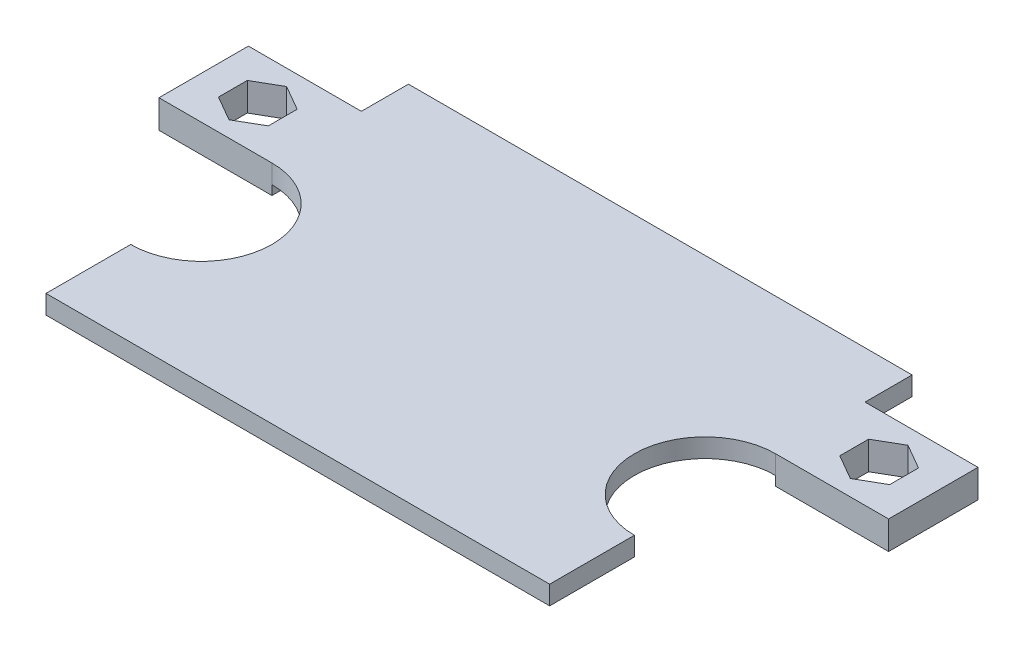
ISO-10303-21;
HEADER;
FILE_DESCRIPTION(('STEP AP214'),'2;1');
FILE_NAME('part.step','',(''),(''),'','','');
FILE_SCHEMA(('AUTOMOTIVE_DESIGN { 1 0 10303 214 1 1 1 1 }'));
ENDSEC;
DATA;
#1=APPLICATION_CONTEXT('core data for automotive mechanical design processes');
#2=APPLICATION_PROTOCOL_DEFINITION('international standard','automotive_design',2000,#1);
#3=PRODUCT_CONTEXT('',#1,'mechanical');
#4=PRODUCT('Part','Part','',(#3));
#5=PRODUCT_RELATED_PRODUCT_CATEGORY('part','',(#4));
#6=PRODUCT_DEFINITION_FORMATION('','',#4);
#7=PRODUCT_DEFINITION_CONTEXT('part definition',#1,'design');
#8=PRODUCT_DEFINITION('design','',#6,#7);
#9=PRODUCT_DEFINITION_SHAPE('','',#8);
#10=(LENGTH_UNIT() NAMED_UNIT(*) SI_UNIT(.MILLI.,.METRE.));
#11=(NAMED_UNIT(*) PLANE_ANGLE_UNIT() SI_UNIT($,.RADIAN.));
#12=(NAMED_UNIT(*) SI_UNIT($,.STERADIAN.) SOLID_ANGLE_UNIT());
#13=UNCERTAINTY_MEASURE_WITH_UNIT(LENGTH_MEASURE(1.E-05),#10,'distance_accuracy_value','');
#14=(GEOMETRIC_REPRESENTATION_CONTEXT(3) GLOBAL_UNCERTAINTY_ASSIGNED_CONTEXT((#13)) GLOBAL_UNIT_ASSIGNED_CONTEXT((#10,
#11,#12)) REPRESENTATION_CONTEXT('',''));
#15=CARTESIAN_POINT('',(0.,0.,0.));
#16=DIRECTION('',(0.,0.,1.));
#17=DIRECTION('',(1.,0.,0.));
#18=AXIS2_PLACEMENT_3D('',#15,#16,#17);
#19=CARTESIAN_POINT('',(26.75,-2.,-19.25));
#20=DIRECTION('',(-1.,0.,0.));
#21=DIRECTION('',(0.,0.,1.));
#22=AXIS2_PLACEMENT_3D('',#19,#20,#21);
#23=PLANE('',#22);
#24=DIRECTION('',(0.,1.,0.));
#25=VECTOR('',#24,1.);
#26=CARTESIAN_POINT('',(26.75,-3.,-14.25));
#27=LINE('',#26,#25);
#28=CARTESIAN_POINT('',(26.75,-2.,-14.25));
#29=VERTEX_POINT('',#28);
#30=CARTESIAN_POINT('',(26.75,0.,-14.25));
#31=VERTEX_POINT('',#30);
#32=EDGE_CURVE('E11',#29,#31,#27,.T.);
#33=ORIENTED_EDGE('',*,*,#32,.F.);
#34=DIRECTION('',(0.,0.,1.));
#35=VECTOR('',#34,1.);
#36=CARTESIAN_POINT('',(26.75,-2.,-19.25));
#37=LINE('',#36,#35);
#38=CARTESIAN_POINT('',(26.75,-2.,-19.25));
#39=VERTEX_POINT('',#38);
#40=EDGE_CURVE('E295',#39,#29,#37,.T.);
#41=ORIENTED_EDGE('',*,*,#40,.F.);
#42=DIRECTION('',(0.,1.,0.));
#43=VECTOR('',#42,1.);
#44=CARTESIAN_POINT('',(26.75,-2.,-19.25));
#45=LINE('',#44,#43);
#46=CARTESIAN_POINT('',(26.75,0.,-19.25));
#47=VERTEX_POINT('',#46);
#48=EDGE_CURVE('E70',#39,#47,#45,.T.);
#49=ORIENTED_EDGE('',*,*,#48,.T.);
#50=DIRECTION('',(0.,0.,1.));
#51=VECTOR('',#50,1.);
#52=CARTESIAN_POINT('',(26.75,0.,-19.25));
#53=LINE('',#52,#51);
#54=EDGE_CURVE('E288',#47,#31,#53,.T.);
#55=ORIENTED_EDGE('',*,*,#54,.T.);
#56=EDGE_LOOP('',(#33,#41,#49,#55));
#57=FACE_BOUND('',#56,.T.);
#58=ADVANCED_FACE('F42',(#57),#23,.F.);
#59=CARTESIAN_POINT('',(-26.75,-2.,-19.25));
#60=DIRECTION('',(-1.,0.,0.));
#61=DIRECTION('',(0.,0.,1.));
#62=AXIS2_PLACEMENT_3D('',#59,#60,#61);
#63=PLANE('',#62);
#64=DIRECTION('',(0.,0.,1.));
#65=VECTOR('',#64,1.);
#66=CARTESIAN_POINT('',(-26.75,-2.,-19.25));
#67=LINE('',#66,#65);
#68=CARTESIAN_POINT('',(-26.75,-2.,-19.25));
#69=VERTEX_POINT('',#68);
#70=CARTESIAN_POINT('',(-26.75,-2.,-14.25));
#71=VERTEX_POINT('',#70);
#72=EDGE_CURVE('E270',#69,#71,#67,.T.);
#73=ORIENTED_EDGE('',*,*,#72,.T.);
#74=DIRECTION('',(0.,1.,0.));
#75=VECTOR('',#74,1.);
#76=CARTESIAN_POINT('',(-26.75,-3.,-14.25));
#77=LINE('',#76,#75);
#78=CARTESIAN_POINT('',(-26.75,0.,-14.25));
#79=VERTEX_POINT('',#78);
#80=EDGE_CURVE('E249',#71,#79,#77,.T.);
#81=ORIENTED_EDGE('',*,*,#80,.T.);
#82=DIRECTION('',(0.,0.,1.));
#83=VECTOR('',#82,1.);
#84=CARTESIAN_POINT('',(-26.75,0.,-19.25));
#85=LINE('',#84,#83);
#86=CARTESIAN_POINT('',(-26.75,0.,-19.25));
#87=VERTEX_POINT('',#86);
#88=EDGE_CURVE('E305',#87,#79,#85,.T.);
#89=ORIENTED_EDGE('',*,*,#88,.F.);
#90=DIRECTION('',(0.,1.,0.));
#91=VECTOR('',#90,1.);
#92=CARTESIAN_POINT('',(-26.75,-2.,-19.25));
#93=LINE('',#92,#91);
#94=EDGE_CURVE('E46',#69,#87,#93,.T.);
#95=ORIENTED_EDGE('',*,*,#94,.F.);
#96=EDGE_LOOP('',(#73,#81,#89,#95));
#97=FACE_BOUND('',#96,.T.);
#98=ADVANCED_FACE('F329',(#97),#63,.T.);
#99=CARTESIAN_POINT('',(26.75,-2.,-19.25));
#100=DIRECTION('',(0.,0.,-1.));
#101=DIRECTION('',(-1.,0.,0.));
#102=AXIS2_PLACEMENT_3D('',#99,#100,#101);
#103=PLANE('',#102);
#104=DIRECTION('',(-1.,0.,0.));
#105=VECTOR('',#104,1.);
#106=CARTESIAN_POINT('',(26.75,0.,-19.25));
#107=LINE('',#106,#105);
#108=EDGE_CURVE('E300',#47,#87,#107,.T.);
#109=ORIENTED_EDGE('',*,*,#108,.F.);
#110=ORIENTED_EDGE('',*,*,#48,.F.);
#111=DIRECTION('',(-1.,0.,0.));
#112=VECTOR('',#111,1.);
#113=CARTESIAN_POINT('',(26.75,-2.,-19.25));
#114=LINE('',#113,#112);
#115=EDGE_CURVE('E286',#39,#69,#114,.T.);
#116=ORIENTED_EDGE('',*,*,#115,.T.);
#117=ORIENTED_EDGE('',*,*,#94,.T.);
#118=EDGE_LOOP('',(#109,#110,#116,#117));
#119=FACE_BOUND('',#118,.T.);
#120=ADVANCED_FACE('F44',(#119),#103,.T.);
#121=CARTESIAN_POINT('',(26.75,-2.,10.25));
#122=VERTEX_POINT('',#121);
#123=CARTESIAN_POINT('',(26.75,-2.,19.25));
#124=VERTEX_POINT('',#123);
#125=EDGE_CURVE('E294',#122,#124,#37,.T.);
#126=ORIENTED_EDGE('',*,*,#125,.F.);
#127=DIRECTION('',(0.,1.,0.));
#128=VECTOR('',#127,1.);
#129=CARTESIAN_POINT('',(26.75,-2.,10.25));
#130=LINE('',#129,#128);
#131=CARTESIAN_POINT('',(26.75,0.,10.25));
#132=VERTEX_POINT('',#131);
#133=EDGE_CURVE('E553',#122,#132,#130,.T.);
#134=ORIENTED_EDGE('',*,*,#133,.T.);
#135=CARTESIAN_POINT('',(26.75,0.,19.25));
#136=VERTEX_POINT('',#135);
#137=EDGE_CURVE('E313',#132,#136,#53,.T.);
#138=ORIENTED_EDGE('',*,*,#137,.T.);
#139=DIRECTION('',(0.,1.,0.));
#140=VECTOR('',#139,1.);
#141=CARTESIAN_POINT('',(26.75,-2.,19.25));
#142=LINE('',#141,#140);
#143=EDGE_CURVE('E318',#124,#136,#142,.T.);
#144=ORIENTED_EDGE('',*,*,#143,.F.);
#145=EDGE_LOOP('',(#126,#134,#138,#144));
#146=FACE_BOUND('',#145,.T.);
#147=ADVANCED_FACE('F352',(#146),#23,.F.);
#148=CARTESIAN_POINT('',(26.75,-2.,19.25));
#149=DIRECTION('',(0.,0.,-1.));
#150=DIRECTION('',(-1.,0.,0.));
#151=AXIS2_PLACEMENT_3D('',#148,#149,#150);
#152=PLANE('',#151);
#153=DIRECTION('',(-1.,0.,0.));
#154=VECTOR('',#153,1.);
#155=CARTESIAN_POINT('',(26.75,0.,19.25));
#156=LINE('',#155,#154);
#157=CARTESIAN_POINT('',(-26.75,0.,19.25));
#158=VERTEX_POINT('',#157);
#159=EDGE_CURVE('E309',#136,#158,#156,.T.);
#160=ORIENTED_EDGE('',*,*,#159,.T.);
#161=DIRECTION('',(0.,1.,0.));
#162=VECTOR('',#161,1.);
#163=CARTESIAN_POINT('',(-26.75,-2.,19.25));
#164=LINE('',#163,#162);
#165=CARTESIAN_POINT('',(-26.75,-2.,19.25));
#166=VERTEX_POINT('',#165);
#167=EDGE_CURVE('E321',#166,#158,#164,.T.);
#168=ORIENTED_EDGE('',*,*,#167,.F.);
#169=DIRECTION('',(-1.,0.,0.));
#170=VECTOR('',#169,1.);
#171=CARTESIAN_POINT('',(26.75,-2.,19.25));
#172=LINE('',#171,#170);
#173=EDGE_CURVE('E291',#124,#166,#172,.T.);
#174=ORIENTED_EDGE('',*,*,#173,.F.);
#175=ORIENTED_EDGE('',*,*,#143,.T.);
#176=EDGE_LOOP('',(#160,#168,#174,#175));
#177=FACE_BOUND('',#176,.T.);
#178=ADVANCED_FACE('F356',(#177),#152,.F.);
#179=DIRECTION('',(0.,1.,0.));
#180=VECTOR('',#179,1.);
#181=CARTESIAN_POINT('',(-26.75,-2.,10.25));
#182=LINE('',#181,#180);
#183=CARTESIAN_POINT('',(-26.75,-2.,10.25));
#184=VERTEX_POINT('',#183);
#185=CARTESIAN_POINT('',(-26.75,0.,10.25));
#186=VERTEX_POINT('',#185);
#187=EDGE_CURVE('E261',#184,#186,#182,.T.);
#188=ORIENTED_EDGE('',*,*,#187,.F.);
#189=EDGE_CURVE('E259',#184,#166,#67,.T.);
#190=ORIENTED_EDGE('',*,*,#189,.T.);
#191=ORIENTED_EDGE('',*,*,#167,.T.);
#192=EDGE_CURVE('E304',#186,#158,#85,.T.);
#193=ORIENTED_EDGE('',*,*,#192,.F.);
#194=EDGE_LOOP('',(#188,#190,#191,#193));
#195=FACE_BOUND('',#194,.T.);
#196=ADVANCED_FACE('F561',(#195),#63,.T.);
#197=CARTESIAN_POINT('',(0.,-2.,0.));
#198=DIRECTION('',(0.,1.,0.));
#199=DIRECTION('',(0.,0.,1.));
#200=AXIS2_PLACEMENT_3D('',#197,#198,#199);
#201=PLANE('',#200);
#202=ORIENTED_EDGE('',*,*,#189,.F.);
#203=CARTESIAN_POINT('',(-26.75,-2.,2.75000000000001));
#204=DIRECTION('',(0.,1.,0.));
#205=DIRECTION('',(0.,0.,-1.));
#206=AXIS2_PLACEMENT_3D('',#203,#204,#205);
#207=CIRCLE('',#206,7.5);
#208=CARTESIAN_POINT('',(-26.75,-2.,-4.74999999999999));
#209=VERTEX_POINT('',#208);
#210=EDGE_CURVE('E240',#184,#209,#207,.T.);
#211=ORIENTED_EDGE('',*,*,#210,.T.);
#212=EDGE_CURVE('E257',#71,#209,#67,.T.);
#213=ORIENTED_EDGE('',*,*,#212,.F.);
#214=ORIENTED_EDGE('',*,*,#72,.F.);
#215=ORIENTED_EDGE('',*,*,#115,.F.);
#216=ORIENTED_EDGE('',*,*,#40,.T.);
#217=CARTESIAN_POINT('',(26.75,-2.,-4.75));
#218=VERTEX_POINT('',#217);
#219=EDGE_CURVE('E299',#29,#218,#37,.T.);
#220=ORIENTED_EDGE('',*,*,#219,.T.);
#221=CARTESIAN_POINT('',(26.75,-2.,2.75));
#222=DIRECTION('',(0.,1.,0.));
#223=DIRECTION('',(0.,0.,1.));
#224=AXIS2_PLACEMENT_3D('',#221,#222,#223);
#225=CIRCLE('',#224,7.5);
#226=EDGE_CURVE('E342',#218,#122,#225,.T.);
#227=ORIENTED_EDGE('',*,*,#226,.T.);
#228=ORIENTED_EDGE('',*,*,#125,.T.);
#229=ORIENTED_EDGE('',*,*,#173,.T.);
#230=EDGE_LOOP('',(#202,#211,#213,#214,#215,#216,#220,#227,#228,#229));
#231=FACE_BOUND('',#230,.T.);
#232=ADVANCED_FACE('F256',(#231),#201,.F.);
#233=CARTESIAN_POINT('',(0.,0.,0.));
#234=DIRECTION('',(0.,1.,0.));
#235=DIRECTION('',(0.,0.,1.));
#236=AXIS2_PLACEMENT_3D('',#233,#234,#235);
#237=PLANE('',#236);
#238=CARTESIAN_POINT('',(-26.75,0.,2.75000000000001));
#239=DIRECTION('',(0.,1.,0.));
#240=DIRECTION('',(0.,0.,-1.));
#241=AXIS2_PLACEMENT_3D('',#238,#239,#240);
#242=CIRCLE('',#241,7.5);
#243=CARTESIAN_POINT('',(-26.75,0.,-4.74999999999999));
#244=VERTEX_POINT('',#243);
#245=EDGE_CURVE('E243',#186,#244,#242,.T.);
#246=ORIENTED_EDGE('',*,*,#245,.F.);
#247=ORIENTED_EDGE('',*,*,#192,.T.);
#248=ORIENTED_EDGE('',*,*,#159,.F.);
#249=ORIENTED_EDGE('',*,*,#137,.F.);
#250=CARTESIAN_POINT('',(26.75,0.,2.75));
#251=DIRECTION('',(0.,1.,0.));
#252=DIRECTION('',(0.,0.,1.));
#253=AXIS2_PLACEMENT_3D('',#250,#251,#252);
#254=CIRCLE('',#253,7.5);
#255=CARTESIAN_POINT('',(26.75,0.,-4.75));
#256=VERTEX_POINT('',#255);
#257=EDGE_CURVE('E552',#256,#132,#254,.T.);
#258=ORIENTED_EDGE('',*,*,#257,.F.);
#259=DIRECTION('',(1.,0.,0.));
#260=VECTOR('',#259,1.);
#261=CARTESIAN_POINT('',(38.75,0.,-4.75));
#262=LINE('',#261,#260);
#263=CARTESIAN_POINT('',(38.75,0.,-4.75));
#264=VERTEX_POINT('',#263);
#265=EDGE_CURVE('E501',#256,#264,#262,.T.);
#266=ORIENTED_EDGE('',*,*,#265,.T.);
#267=DIRECTION('',(0.,0.,-1.));
#268=VECTOR('',#267,1.);
#269=CARTESIAN_POINT('',(38.75,0.,-4.75));
#270=LINE('',#269,#268);
#271=CARTESIAN_POINT('',(38.75,0.,-14.25));
#272=VERTEX_POINT('',#271);
#273=EDGE_CURVE('E536',#264,#272,#270,.T.);
#274=ORIENTED_EDGE('',*,*,#273,.T.);
#275=DIRECTION('',(-1.,0.,0.));
#276=VECTOR('',#275,1.);
#277=CARTESIAN_POINT('',(38.75,0.,-14.25));
#278=LINE('',#277,#276);
#279=EDGE_CURVE('E336',#272,#31,#278,.T.);
#280=ORIENTED_EDGE('',*,*,#279,.T.);
#281=ORIENTED_EDGE('',*,*,#54,.F.);
#282=ORIENTED_EDGE('',*,*,#108,.T.);
#283=ORIENTED_EDGE('',*,*,#88,.T.);
#284=DIRECTION('',(-1.,0.,0.));
#285=VECTOR('',#284,1.);
#286=CARTESIAN_POINT('',(-38.75,0.,-14.25));
#287=LINE('',#286,#285);
#288=CARTESIAN_POINT('',(-38.75,0.,-14.25));
#289=VERTEX_POINT('',#288);
#290=EDGE_CURVE('E61',#79,#289,#287,.T.);
#291=ORIENTED_EDGE('',*,*,#290,.T.);
#292=DIRECTION('',(0.,0.,1.));
#293=VECTOR('',#292,1.);
#294=CARTESIAN_POINT('',(-38.75,0.,-4.74999999999999));
#295=LINE('',#294,#293);
#296=CARTESIAN_POINT('',(-38.75,0.,-4.74999999999999));
#297=VERTEX_POINT('',#296);
#298=EDGE_CURVE('E369',#289,#297,#295,.T.);
#299=ORIENTED_EDGE('',*,*,#298,.T.);
#300=DIRECTION('',(1.,0.,0.));
#301=VECTOR('',#300,1.);
#302=CARTESIAN_POINT('',(-38.75,0.,-4.74999999999999));
#303=LINE('',#302,#301);
#304=EDGE_CURVE('E366',#297,#244,#303,.T.);
#305=ORIENTED_EDGE('',*,*,#304,.T.);
#306=EDGE_LOOP('',(#246,#247,#248,#249,#258,#266,#274,#280,#281,#282,#283,#291,#299,#305));
#307=FACE_BOUND('',#306,.T.);
#308=DIRECTION('',(0.866025403784439,0.,-0.5));
#309=VECTOR('',#308,1.);
#310=CARTESIAN_POINT('',(-33.,0.,-6.44004357329498));
#311=LINE('',#310,#309);
#312=CARTESIAN_POINT('',(-33.,0.,-6.44004357329498));
#313=VERTEX_POINT('',#312);
#314=CARTESIAN_POINT('',(-30.35,0.,-7.97002178664749));
#315=VERTEX_POINT('',#314);
#316=EDGE_CURVE('E420',#313,#315,#311,.T.);
#317=ORIENTED_EDGE('',*,*,#316,.F.);
#318=DIRECTION('',(0.866025403784439,0.,0.5));
#319=VECTOR('',#318,1.);
#320=CARTESIAN_POINT('',(-35.65,0.,-7.97002178664748));
#321=LINE('',#320,#319);
#322=CARTESIAN_POINT('',(-35.65,0.,-7.97002178664748));
#323=VERTEX_POINT('',#322);
#324=EDGE_CURVE('E424',#323,#313,#321,.T.);
#325=ORIENTED_EDGE('',*,*,#324,.F.);
#326=DIRECTION('',(0.,0.,1.));
#327=VECTOR('',#326,1.);
#328=CARTESIAN_POINT('',(-35.65,0.,-11.0299782133525));
#329=LINE('',#328,#327);
#330=CARTESIAN_POINT('',(-35.65,0.,-11.0299782133525));
#331=VERTEX_POINT('',#330);
#332=EDGE_CURVE('E403',#331,#323,#329,.T.);
#333=ORIENTED_EDGE('',*,*,#332,.F.);
#334=DIRECTION('',(-0.866025403784439,0.,0.5));
#335=VECTOR('',#334,1.);
#336=CARTESIAN_POINT('',(-33.,0.,-12.559956426705));
#337=LINE('',#336,#335);
#338=CARTESIAN_POINT('',(-33.,0.,-12.559956426705));
#339=VERTEX_POINT('',#338);
#340=EDGE_CURVE('E408',#339,#331,#337,.T.);
#341=ORIENTED_EDGE('',*,*,#340,.F.);
#342=DIRECTION('',(-0.866025403784439,0.,-0.5));
#343=VECTOR('',#342,1.);
#344=CARTESIAN_POINT('',(-30.35,0.,-11.0299782133525));
#345=LINE('',#344,#343);
#346=CARTESIAN_POINT('',(-30.35,0.,-11.0299782133525));
#347=VERTEX_POINT('',#346);
#348=EDGE_CURVE('E412',#347,#339,#345,.T.);
#349=ORIENTED_EDGE('',*,*,#348,.F.);
#350=DIRECTION('',(0.,0.,-1.));
#351=VECTOR('',#350,1.);
#352=CARTESIAN_POINT('',(-30.35,0.,-7.97002178664749));
#353=LINE('',#352,#351);
#354=EDGE_CURVE('E416',#315,#347,#353,.T.);
#355=ORIENTED_EDGE('',*,*,#354,.F.);
#356=EDGE_LOOP('',(#317,#325,#333,#341,#349,#355));
#357=FACE_BOUND('',#356,.T.);
#358=DIRECTION('',(0.,0.,-1.));
#359=VECTOR('',#358,1.);
#360=CARTESIAN_POINT('',(35.65,0.,-11.0299782133525));
#361=LINE('',#360,#359);
#362=CARTESIAN_POINT('',(35.65,0.,-7.9700217866475));
#363=VERTEX_POINT('',#362);
#364=CARTESIAN_POINT('',(35.65,0.,-11.0299782133525));
#365=VERTEX_POINT('',#364);
#366=EDGE_CURVE('E427',#363,#365,#361,.T.);
#367=ORIENTED_EDGE('',*,*,#366,.F.);
#368=DIRECTION('',(0.866025403784437,0.,-0.500000000000003));
#369=VECTOR('',#368,1.);
#370=CARTESIAN_POINT('',(35.65,0.,-7.9700217866475));
#371=LINE('',#370,#369);
#372=CARTESIAN_POINT('',(33.,0.,-6.44004357329499));
#373=VERTEX_POINT('',#372);
#374=EDGE_CURVE('E454',#373,#363,#371,.T.);
#375=ORIENTED_EDGE('',*,*,#374,.F.);
#376=DIRECTION('',(0.866025403784439,0.,0.5));
#377=VECTOR('',#376,1.);
#378=CARTESIAN_POINT('',(33.,0.,-6.44004357329499));
#379=LINE('',#378,#377);
#380=CARTESIAN_POINT('',(30.35,0.,-7.9700217866475));
#381=VERTEX_POINT('',#380);
#382=EDGE_CURVE('E490',#381,#373,#379,.T.);
#383=ORIENTED_EDGE('',*,*,#382,.F.);
#384=DIRECTION('',(0.,0.,1.));
#385=VECTOR('',#384,1.);
#386=CARTESIAN_POINT('',(30.35,0.,-7.9700217866475));
#387=LINE('',#386,#385);
#388=CARTESIAN_POINT('',(30.35,0.,-11.0299782133525));
#389=VERTEX_POINT('',#388);
#390=EDGE_CURVE('E486',#389,#381,#387,.T.);
#391=ORIENTED_EDGE('',*,*,#390,.F.);
#392=DIRECTION('',(-0.866025403784439,0.,0.5));
#393=VECTOR('',#392,1.);
#394=CARTESIAN_POINT('',(30.35,0.,-11.0299782133525));
#395=LINE('',#394,#393);
#396=CARTESIAN_POINT('',(33.,0.,-12.559956426705));
#397=VERTEX_POINT('',#396);
#398=EDGE_CURVE('E482',#397,#389,#395,.T.);
#399=ORIENTED_EDGE('',*,*,#398,.F.);
#400=DIRECTION('',(-0.866025403784438,0.,-0.500000000000002));
#401=VECTOR('',#400,1.);
#402=CARTESIAN_POINT('',(33.,0.,-12.559956426705));
#403=LINE('',#402,#401);
#404=EDGE_CURVE('E478',#365,#397,#403,.T.);
#405=ORIENTED_EDGE('',*,*,#404,.F.);
#406=EDGE_LOOP('',(#367,#375,#383,#391,#399,#405));
#407=FACE_BOUND('',#406,.T.);
#408=ADVANCED_FACE('F331',(#307,#357,#407),#237,.T.);
#409=CARTESIAN_POINT('',(-38.75,-3.,-4.74999999999999));
#410=DIRECTION('',(-1.,0.,0.));
#411=DIRECTION('',(0.,0.,1.));
#412=AXIS2_PLACEMENT_3D('',#409,#410,#411);
#413=PLANE('',#412);
#414=ORIENTED_EDGE('',*,*,#298,.F.);
#415=DIRECTION('',(0.,1.,0.));
#416=VECTOR('',#415,1.);
#417=CARTESIAN_POINT('',(-38.75,-3.,-14.25));
#418=LINE('',#417,#416);
#419=CARTESIAN_POINT('',(-38.75,-3.,-14.25));
#420=VERTEX_POINT('',#419);
#421=EDGE_CURVE('E280',#420,#289,#418,.T.);
#422=ORIENTED_EDGE('',*,*,#421,.F.);
#423=DIRECTION('',(0.,0.,1.));
#424=VECTOR('',#423,1.);
#425=CARTESIAN_POINT('',(-38.75,-3.,-4.74999999999999));
#426=LINE('',#425,#424);
#427=CARTESIAN_POINT('',(-38.75,-3.,-4.74999999999999));
#428=VERTEX_POINT('',#427);
#429=EDGE_CURVE('E365',#420,#428,#426,.T.);
#430=ORIENTED_EDGE('',*,*,#429,.T.);
#431=DIRECTION('',(0.,1.,0.));
#432=VECTOR('',#431,1.);
#433=CARTESIAN_POINT('',(-38.75,-3.,-4.74999999999999));
#434=LINE('',#433,#432);
#435=EDGE_CURVE('E277',#428,#297,#434,.T.);
#436=ORIENTED_EDGE('',*,*,#435,.T.);
#437=EDGE_LOOP('',(#414,#422,#430,#436));
#438=FACE_BOUND('',#437,.T.);
#439=ADVANCED_FACE('F597',(#438),#413,.T.);
#440=CARTESIAN_POINT('',(-38.75,-3.,-14.25));
#441=DIRECTION('',(0.,0.,-1.));
#442=DIRECTION('',(-1.,0.,0.));
#443=AXIS2_PLACEMENT_3D('',#440,#441,#442);
#444=PLANE('',#443);
#445=ORIENTED_EDGE('',*,*,#290,.F.);
#446=ORIENTED_EDGE('',*,*,#80,.F.);
#447=CARTESIAN_POINT('',(-26.75,-3.,-14.25));
#448=VERTEX_POINT('',#447);
#449=EDGE_CURVE('E268',#448,#71,#77,.T.);
#450=ORIENTED_EDGE('',*,*,#449,.F.);
#451=DIRECTION('',(-1.,0.,0.));
#452=VECTOR('',#451,1.);
#453=CARTESIAN_POINT('',(-38.75,-3.,-14.25));
#454=LINE('',#453,#452);
#455=EDGE_CURVE('E282',#448,#420,#454,.T.);
#456=ORIENTED_EDGE('',*,*,#455,.T.);
#457=ORIENTED_EDGE('',*,*,#421,.T.);
#458=EDGE_LOOP('',(#445,#446,#450,#456,#457));
#459=FACE_BOUND('',#458,.T.);
#460=ADVANCED_FACE('F602',(#459),#444,.T.);
#461=CARTESIAN_POINT('',(-26.75,-3.,-14.25));
#462=DIRECTION('',(1.,0.,0.));
#463=DIRECTION('',(0.,0.,-1.));
#464=AXIS2_PLACEMENT_3D('',#461,#462,#463);
#465=PLANE('',#464);
#466=ORIENTED_EDGE('',*,*,#449,.T.);
#467=ORIENTED_EDGE('',*,*,#212,.T.);
#468=DIRECTION('',(0.,1.,0.));
#469=VECTOR('',#468,1.);
#470=CARTESIAN_POINT('',(-26.75,-3.,-4.74999999999999));
#471=LINE('',#470,#469);
#472=CARTESIAN_POINT('',(-26.75,-3.,-4.74999999999999));
#473=VERTEX_POINT('',#472);
#474=EDGE_CURVE('E251',#473,#209,#471,.T.);
#475=ORIENTED_EDGE('',*,*,#474,.F.);
#476=DIRECTION('',(0.,0.,-1.));
#477=VECTOR('',#476,1.);
#478=CARTESIAN_POINT('',(-26.75,-3.,-14.25));
#479=LINE('',#478,#477);
#480=EDGE_CURVE('E376',#473,#448,#479,.T.);
#481=ORIENTED_EDGE('',*,*,#480,.T.);
#482=EDGE_LOOP('',(#466,#467,#475,#481));
#483=FACE_BOUND('',#482,.T.);
#484=ADVANCED_FACE('F265',(#483),#465,.T.);
#485=CARTESIAN_POINT('',(-38.75,-3.,-4.74999999999999));
#486=DIRECTION('',(0.,0.,1.));
#487=DIRECTION('',(1.,0.,0.));
#488=AXIS2_PLACEMENT_3D('',#485,#486,#487);
#489=PLANE('',#488);
#490=ORIENTED_EDGE('',*,*,#304,.F.);
#491=ORIENTED_EDGE('',*,*,#435,.F.);
#492=DIRECTION('',(1.,0.,0.));
#493=VECTOR('',#492,1.);
#494=CARTESIAN_POINT('',(-38.75,-3.,-4.74999999999999));
#495=LINE('',#494,#493);
#496=EDGE_CURVE('E275',#428,#473,#495,.T.);
#497=ORIENTED_EDGE('',*,*,#496,.T.);
#498=ORIENTED_EDGE('',*,*,#474,.T.);
#499=EDGE_CURVE('E237',#209,#244,#471,.T.);
#500=ORIENTED_EDGE('',*,*,#499,.T.);
#501=EDGE_LOOP('',(#490,#491,#497,#498,#500));
#502=FACE_BOUND('',#501,.T.);
#503=ADVANCED_FACE('F273',(#502),#489,.T.);
#504=CARTESIAN_POINT('',(0.,-3.,0.));
#505=DIRECTION('',(0.,-1.,0.));
#506=DIRECTION('',(0.,0.,-1.));
#507=AXIS2_PLACEMENT_3D('',#504,#505,#506);
#508=PLANE('',#507);
#509=DIRECTION('',(0.866025403784439,0.,0.5));
#510=VECTOR('',#509,1.);
#511=CARTESIAN_POINT('',(-35.65,-3.,-7.97002178664748));
#512=LINE('',#511,#510);
#513=CARTESIAN_POINT('',(-35.65,-3.,-7.97002178664748));
#514=VERTEX_POINT('',#513);
#515=CARTESIAN_POINT('',(-33.,-3.,-6.44004357329498));
#516=VERTEX_POINT('',#515);
#517=EDGE_CURVE('E407',#514,#516,#512,.T.);
#518=ORIENTED_EDGE('',*,*,#517,.T.);
#519=DIRECTION('',(0.866025403784439,0.,-0.5));
#520=VECTOR('',#519,1.);
#521=CARTESIAN_POINT('',(-33.,-3.,-6.44004357329498));
#522=LINE('',#521,#520);
#523=CARTESIAN_POINT('',(-30.35,-3.,-7.97002178664749));
#524=VERTEX_POINT('',#523);
#525=EDGE_CURVE('E443',#516,#524,#522,.T.);
#526=ORIENTED_EDGE('',*,*,#525,.T.);
#527=DIRECTION('',(0.,0.,-1.));
#528=VECTOR('',#527,1.);
#529=CARTESIAN_POINT('',(-30.35,-3.,-7.97002178664749));
#530=LINE('',#529,#528);
#531=CARTESIAN_POINT('',(-30.35,-3.,-11.0299782133525));
#532=VERTEX_POINT('',#531);
#533=EDGE_CURVE('E439',#524,#532,#530,.T.);
#534=ORIENTED_EDGE('',*,*,#533,.T.);
#535=DIRECTION('',(-0.866025403784439,0.,-0.5));
#536=VECTOR('',#535,1.);
#537=CARTESIAN_POINT('',(-30.35,-3.,-11.0299782133525));
#538=LINE('',#537,#536);
#539=CARTESIAN_POINT('',(-33.,-3.,-12.559956426705));
#540=VERTEX_POINT('',#539);
#541=EDGE_CURVE('E435',#532,#540,#538,.T.);
#542=ORIENTED_EDGE('',*,*,#541,.T.);
#543=DIRECTION('',(-0.866025403784439,0.,0.5));
#544=VECTOR('',#543,1.);
#545=CARTESIAN_POINT('',(-33.,-3.,-12.559956426705));
#546=LINE('',#545,#544);
#547=CARTESIAN_POINT('',(-35.65,-3.,-11.0299782133525));
#548=VERTEX_POINT('',#547);
#549=EDGE_CURVE('E431',#540,#548,#546,.T.);
#550=ORIENTED_EDGE('',*,*,#549,.T.);
#551=DIRECTION('',(0.,0.,1.));
#552=VECTOR('',#551,1.);
#553=CARTESIAN_POINT('',(-35.65,-3.,-11.0299782133525));
#554=LINE('',#553,#552);
#555=EDGE_CURVE('E389',#548,#514,#554,.T.);
#556=ORIENTED_EDGE('',*,*,#555,.T.);
#557=EDGE_LOOP('',(#518,#526,#534,#542,#550,#556));
#558=FACE_BOUND('',#557,.T.);
#559=ORIENTED_EDGE('',*,*,#429,.F.);
#560=ORIENTED_EDGE('',*,*,#455,.F.);
#561=ORIENTED_EDGE('',*,*,#480,.F.);
#562=ORIENTED_EDGE('',*,*,#496,.F.);
#563=EDGE_LOOP('',(#559,#560,#561,#562));
#564=FACE_BOUND('',#563,.T.);
#565=ADVANCED_FACE('F622',(#558,#564),#508,.T.);
#566=CARTESIAN_POINT('',(-35.65,-3.,-7.97002178664748));
#567=DIRECTION('',(-0.5,0.,0.866025403784438));
#568=DIRECTION('',(0.866025403784439,0.,0.5));
#569=AXIS2_PLACEMENT_3D('',#566,#567,#568);
#570=PLANE('',#569);
#571=ORIENTED_EDGE('',*,*,#324,.T.);
#572=DIRECTION('',(0.,1.,0.));
#573=VECTOR('',#572,1.);
#574=CARTESIAN_POINT('',(-33.,-3.,-6.44004357329498));
#575=LINE('',#574,#573);
#576=EDGE_CURVE('E384',#516,#313,#575,.T.);
#577=ORIENTED_EDGE('',*,*,#576,.F.);
#578=ORIENTED_EDGE('',*,*,#517,.F.);
#579=DIRECTION('',(0.,1.,0.));
#580=VECTOR('',#579,1.);
#581=CARTESIAN_POINT('',(-35.65,-3.,-7.97002178664748));
#582=LINE('',#581,#580);
#583=EDGE_CURVE('E373',#514,#323,#582,.T.);
#584=ORIENTED_EDGE('',*,*,#583,.T.);
#585=EDGE_LOOP('',(#571,#577,#578,#584));
#586=FACE_BOUND('',#585,.T.);
#587=ADVANCED_FACE('F627',(#586),#570,.F.);
#588=CARTESIAN_POINT('',(-35.65,-3.,-11.0299782133525));
#589=DIRECTION('',(-1.,0.,0.));
#590=DIRECTION('',(0.,0.,1.));
#591=AXIS2_PLACEMENT_3D('',#588,#589,#590);
#592=PLANE('',#591);
#593=ORIENTED_EDGE('',*,*,#332,.T.);
#594=ORIENTED_EDGE('',*,*,#583,.F.);
#595=ORIENTED_EDGE('',*,*,#555,.F.);
#596=DIRECTION('',(0.,1.,0.));
#597=VECTOR('',#596,1.);
#598=CARTESIAN_POINT('',(-35.65,-3.,-11.0299782133525));
#599=LINE('',#598,#597);
#600=EDGE_CURVE('E398',#548,#331,#599,.T.);
#601=ORIENTED_EDGE('',*,*,#600,.T.);
#602=EDGE_LOOP('',(#593,#594,#595,#601));
#603=FACE_BOUND('',#602,.T.);
#604=ADVANCED_FACE('F640',(#603),#592,.F.);
#605=CARTESIAN_POINT('',(-33.,-3.,-12.559956426705));
#606=DIRECTION('',(-0.5,0.,-0.866025403784439));
#607=DIRECTION('',(-0.866025403784439,0.,0.5));
#608=AXIS2_PLACEMENT_3D('',#605,#606,#607);
#609=PLANE('',#608);
#610=ORIENTED_EDGE('',*,*,#340,.T.);
#611=ORIENTED_EDGE('',*,*,#600,.F.);
#612=ORIENTED_EDGE('',*,*,#549,.F.);
#613=DIRECTION('',(0.,1.,0.));
#614=VECTOR('',#613,1.);
#615=CARTESIAN_POINT('',(-33.,-3.,-12.559956426705));
#616=LINE('',#615,#614);
#617=EDGE_CURVE('E395',#540,#339,#616,.T.);
#618=ORIENTED_EDGE('',*,*,#617,.T.);
#619=EDGE_LOOP('',(#610,#611,#612,#618));
#620=FACE_BOUND('',#619,.T.);
#621=ADVANCED_FACE('F651',(#620),#609,.F.);
#622=CARTESIAN_POINT('',(-30.35,-3.,-11.0299782133525));
#623=DIRECTION('',(0.5,0.,-0.866025403784438));
#624=DIRECTION('',(-0.866025403784439,0.,-0.5));
#625=AXIS2_PLACEMENT_3D('',#622,#623,#624);
#626=PLANE('',#625);
#627=ORIENTED_EDGE('',*,*,#348,.T.);
#628=ORIENTED_EDGE('',*,*,#617,.F.);
#629=ORIENTED_EDGE('',*,*,#541,.F.);
#630=DIRECTION('',(0.,1.,0.));
#631=VECTOR('',#630,1.);
#632=CARTESIAN_POINT('',(-30.35,-3.,-11.0299782133525));
#633=LINE('',#632,#631);
#634=EDGE_CURVE('E392',#532,#347,#633,.T.);
#635=ORIENTED_EDGE('',*,*,#634,.T.);
#636=EDGE_LOOP('',(#627,#628,#629,#635));
#637=FACE_BOUND('',#636,.T.);
#638=ADVANCED_FACE('F662',(#637),#626,.F.);
#639=CARTESIAN_POINT('',(-30.35,-3.,-7.97002178664749));
#640=DIRECTION('',(1.,0.,0.));
#641=DIRECTION('',(0.,0.,-1.));
#642=AXIS2_PLACEMENT_3D('',#639,#640,#641);
#643=PLANE('',#642);
#644=ORIENTED_EDGE('',*,*,#354,.T.);
#645=ORIENTED_EDGE('',*,*,#634,.F.);
#646=ORIENTED_EDGE('',*,*,#533,.F.);
#647=DIRECTION('',(0.,1.,0.));
#648=VECTOR('',#647,1.);
#649=CARTESIAN_POINT('',(-30.35,-3.,-7.97002178664749));
#650=LINE('',#649,#648);
#651=EDGE_CURVE('E388',#524,#315,#650,.T.);
#652=ORIENTED_EDGE('',*,*,#651,.T.);
#653=EDGE_LOOP('',(#644,#645,#646,#652));
#654=FACE_BOUND('',#653,.T.);
#655=ADVANCED_FACE('F673',(#654),#643,.F.);
#656=CARTESIAN_POINT('',(-33.,-3.,-6.44004357329498));
#657=DIRECTION('',(0.5,0.,0.866025403784438));
#658=DIRECTION('',(0.866025403784439,0.,-0.5));
#659=AXIS2_PLACEMENT_3D('',#656,#657,#658);
#660=PLANE('',#659);
#661=ORIENTED_EDGE('',*,*,#316,.T.);
#662=ORIENTED_EDGE('',*,*,#651,.F.);
#663=ORIENTED_EDGE('',*,*,#525,.F.);
#664=ORIENTED_EDGE('',*,*,#576,.T.);
#665=EDGE_LOOP('',(#661,#662,#663,#664));
#666=FACE_BOUND('',#665,.T.);
#667=ADVANCED_FACE('F684',(#666),#660,.F.);
#668=CARTESIAN_POINT('',(26.75,-3.,-14.25));
#669=DIRECTION('',(-1.,0.,0.));
#670=DIRECTION('',(0.,0.,1.));
#671=AXIS2_PLACEMENT_3D('',#668,#669,#670);
#672=PLANE('',#671);
#673=ORIENTED_EDGE('',*,*,#219,.F.);
#674=CARTESIAN_POINT('',(26.75,-3.,-14.25));
#675=VERTEX_POINT('',#674);
#676=EDGE_CURVE('E54',#675,#29,#27,.T.);
#677=ORIENTED_EDGE('',*,*,#676,.F.);
#678=DIRECTION('',(0.,0.,1.));
#679=VECTOR('',#678,1.);
#680=CARTESIAN_POINT('',(26.75,-3.,-14.25));
#681=LINE('',#680,#679);
#682=CARTESIAN_POINT('',(26.75,-3.,-4.75));
#683=VERTEX_POINT('',#682);
#684=EDGE_CURVE('E528',#675,#683,#681,.T.);
#685=ORIENTED_EDGE('',*,*,#684,.T.);
#686=DIRECTION('',(0.,1.,0.));
#687=VECTOR('',#686,1.);
#688=CARTESIAN_POINT('',(26.75,-3.,-4.75));
#689=LINE('',#688,#687);
#690=EDGE_CURVE('E541',#683,#218,#689,.T.);
#691=ORIENTED_EDGE('',*,*,#690,.T.);
#692=EDGE_LOOP('',(#673,#677,#685,#691));
#693=FACE_BOUND('',#692,.T.);
#694=ADVANCED_FACE('F695',(#693),#672,.T.);
#695=CARTESIAN_POINT('',(38.75,-3.,-4.75));
#696=DIRECTION('',(0.,0.,1.));
#697=DIRECTION('',(1.,0.,0.));
#698=AXIS2_PLACEMENT_3D('',#695,#696,#697);
#699=PLANE('',#698);
#700=ORIENTED_EDGE('',*,*,#265,.F.);
#701=EDGE_CURVE('E52',#218,#256,#689,.T.);
#702=ORIENTED_EDGE('',*,*,#701,.F.);
#703=ORIENTED_EDGE('',*,*,#690,.F.);
#704=DIRECTION('',(1.,0.,0.));
#705=VECTOR('',#704,1.);
#706=CARTESIAN_POINT('',(38.75,-3.,-4.75));
#707=LINE('',#706,#705);
#708=CARTESIAN_POINT('',(38.75,-3.,-4.75));
#709=VERTEX_POINT('',#708);
#710=EDGE_CURVE('E516',#683,#709,#707,.T.);
#711=ORIENTED_EDGE('',*,*,#710,.T.);
#712=DIRECTION('',(0.,1.,0.));
#713=VECTOR('',#712,1.);
#714=CARTESIAN_POINT('',(38.75,-3.,-4.75));
#715=LINE('',#714,#713);
#716=EDGE_CURVE('E532',#709,#264,#715,.T.);
#717=ORIENTED_EDGE('',*,*,#716,.T.);
#718=EDGE_LOOP('',(#700,#702,#703,#711,#717));
#719=FACE_BOUND('',#718,.T.);
#720=ADVANCED_FACE('F710',(#719),#699,.T.);
#721=CARTESIAN_POINT('',(38.75,-3.,-14.25));
#722=DIRECTION('',(0.,0.,-1.));
#723=DIRECTION('',(-1.,0.,0.));
#724=AXIS2_PLACEMENT_3D('',#721,#722,#723);
#725=PLANE('',#724);
#726=ORIENTED_EDGE('',*,*,#279,.F.);
#727=DIRECTION('',(0.,1.,0.));
#728=VECTOR('',#727,1.);
#729=CARTESIAN_POINT('',(38.75,-3.,-14.25));
#730=LINE('',#729,#728);
#731=CARTESIAN_POINT('',(38.75,-3.,-14.25));
#732=VERTEX_POINT('',#731);
#733=EDGE_CURVE('E545',#732,#272,#730,.T.);
#734=ORIENTED_EDGE('',*,*,#733,.F.);
#735=DIRECTION('',(-1.,0.,0.));
#736=VECTOR('',#735,1.);
#737=CARTESIAN_POINT('',(38.75,-3.,-14.25));
#738=LINE('',#737,#736);
#739=EDGE_CURVE('E524',#732,#675,#738,.T.);
#740=ORIENTED_EDGE('',*,*,#739,.T.);
#741=ORIENTED_EDGE('',*,*,#676,.T.);
#742=ORIENTED_EDGE('',*,*,#32,.T.);
#743=EDGE_LOOP('',(#726,#734,#740,#741,#742));
#744=FACE_BOUND('',#743,.T.);
#745=ADVANCED_FACE('F704',(#744),#725,.T.);
#746=CARTESIAN_POINT('',(38.75,-3.,-4.75));
#747=DIRECTION('',(1.,0.,0.));
#748=DIRECTION('',(0.,0.,-1.));
#749=AXIS2_PLACEMENT_3D('',#746,#747,#748);
#750=PLANE('',#749);
#751=ORIENTED_EDGE('',*,*,#273,.F.);
#752=ORIENTED_EDGE('',*,*,#716,.F.);
#753=DIRECTION('',(0.,0.,-1.));
#754=VECTOR('',#753,1.);
#755=CARTESIAN_POINT('',(38.75,-3.,-4.75));
#756=LINE('',#755,#754);
#757=EDGE_CURVE('E520',#709,#732,#756,.T.);
#758=ORIENTED_EDGE('',*,*,#757,.T.);
#759=ORIENTED_EDGE('',*,*,#733,.T.);
#760=EDGE_LOOP('',(#751,#752,#758,#759));
#761=FACE_BOUND('',#760,.T.);
#762=ADVANCED_FACE('F709',(#761),#750,.T.);
#763=CARTESIAN_POINT('',(0.,-3.,0.));
#764=DIRECTION('',(0.,1.,0.));
#765=DIRECTION('',(0.,0.,1.));
#766=AXIS2_PLACEMENT_3D('',#763,#764,#765);
#767=PLANE('',#766);
#768=DIRECTION('',(0.866025403784437,0.,-0.500000000000003));
#769=VECTOR('',#768,1.);
#770=CARTESIAN_POINT('',(35.65,-3.,-7.9700217866475));
#771=LINE('',#770,#769);
#772=CARTESIAN_POINT('',(33.,-3.,-6.44004357329499));
#773=VERTEX_POINT('',#772);
#774=CARTESIAN_POINT('',(35.65,-3.,-7.9700217866475));
#775=VERTEX_POINT('',#774);
#776=EDGE_CURVE('E471',#773,#775,#771,.T.);
#777=ORIENTED_EDGE('',*,*,#776,.T.);
#778=DIRECTION('',(0.,0.,-1.));
#779=VECTOR('',#778,1.);
#780=CARTESIAN_POINT('',(35.65,-3.,-11.0299782133525));
#781=LINE('',#780,#779);
#782=CARTESIAN_POINT('',(35.65,-3.,-11.0299782133525));
#783=VERTEX_POINT('',#782);
#784=EDGE_CURVE('E450',#775,#783,#781,.T.);
#785=ORIENTED_EDGE('',*,*,#784,.T.);
#786=DIRECTION('',(-0.866025403784438,0.,-0.500000000000002));
#787=VECTOR('',#786,1.);
#788=CARTESIAN_POINT('',(33.,-3.,-12.559956426705));
#789=LINE('',#788,#787);
#790=CARTESIAN_POINT('',(33.,-3.,-12.559956426705));
#791=VERTEX_POINT('',#790);
#792=EDGE_CURVE('E455',#783,#791,#789,.T.);
#793=ORIENTED_EDGE('',*,*,#792,.T.);
#794=DIRECTION('',(-0.866025403784439,0.,0.5));
#795=VECTOR('',#794,1.);
#796=CARTESIAN_POINT('',(30.35,-3.,-11.0299782133525));
#797=LINE('',#796,#795);
#798=CARTESIAN_POINT('',(30.35,-3.,-11.0299782133525));
#799=VERTEX_POINT('',#798);
#800=EDGE_CURVE('E459',#791,#799,#797,.T.);
#801=ORIENTED_EDGE('',*,*,#800,.T.);
#802=DIRECTION('',(0.,0.,1.));
#803=VECTOR('',#802,1.);
#804=CARTESIAN_POINT('',(30.35,-3.,-7.9700217866475));
#805=LINE('',#804,#803);
#806=CARTESIAN_POINT('',(30.35,-3.,-7.9700217866475));
#807=VERTEX_POINT('',#806);
#808=EDGE_CURVE('E463',#799,#807,#805,.T.);
#809=ORIENTED_EDGE('',*,*,#808,.T.);
#810=DIRECTION('',(0.866025403784439,0.,0.5));
#811=VECTOR('',#810,1.);
#812=CARTESIAN_POINT('',(33.,-3.,-6.44004357329499));
#813=LINE('',#812,#811);
#814=EDGE_CURVE('E467',#807,#773,#813,.T.);
#815=ORIENTED_EDGE('',*,*,#814,.T.);
#816=EDGE_LOOP('',(#777,#785,#793,#801,#809,#815));
#817=FACE_BOUND('',#816,.T.);
#818=ORIENTED_EDGE('',*,*,#710,.F.);
#819=ORIENTED_EDGE('',*,*,#684,.F.);
#820=ORIENTED_EDGE('',*,*,#739,.F.);
#821=ORIENTED_EDGE('',*,*,#757,.F.);
#822=EDGE_LOOP('',(#818,#819,#820,#821));
#823=FACE_BOUND('',#822,.T.);
#824=ADVANCED_FACE('F722',(#817,#823),#767,.F.);
#825=CARTESIAN_POINT('',(35.65,-3.,-11.0299782133525));
#826=DIRECTION('',(1.,0.,0.));
#827=DIRECTION('',(0.,0.,-1.));
#828=AXIS2_PLACEMENT_3D('',#825,#826,#827);
#829=PLANE('',#828);
#830=ORIENTED_EDGE('',*,*,#366,.T.);
#831=DIRECTION('',(0.,1.,0.));
#832=VECTOR('',#831,1.);
#833=CARTESIAN_POINT('',(35.65,-3.,-11.0299782133525));
#834=LINE('',#833,#832);
#835=EDGE_CURVE('E475',#783,#365,#834,.T.);
#836=ORIENTED_EDGE('',*,*,#835,.F.);
#837=ORIENTED_EDGE('',*,*,#784,.F.);
#838=DIRECTION('',(0.,1.,0.));
#839=VECTOR('',#838,1.);
#840=CARTESIAN_POINT('',(35.65,-3.,-7.9700217866475));
#841=LINE('',#840,#839);
#842=EDGE_CURVE('E497',#775,#363,#841,.T.);
#843=ORIENTED_EDGE('',*,*,#842,.T.);
#844=EDGE_LOOP('',(#830,#836,#837,#843));
#845=FACE_BOUND('',#844,.T.);
#846=ADVANCED_FACE('F733',(#845),#829,.F.);
#847=CARTESIAN_POINT('',(35.65,-3.,-7.9700217866475));
#848=DIRECTION('',(0.500000000000003,0.,0.866025403784437));
#849=DIRECTION('',(0.866025403784437,0.,-0.500000000000003));
#850=AXIS2_PLACEMENT_3D('',#847,#848,#849);
#851=PLANE('',#850);
#852=ORIENTED_EDGE('',*,*,#374,.T.);
#853=ORIENTED_EDGE('',*,*,#842,.F.);
#854=ORIENTED_EDGE('',*,*,#776,.F.);
#855=DIRECTION('',(0.,1.,0.));
#856=VECTOR('',#855,1.);
#857=CARTESIAN_POINT('',(33.,-3.,-6.44004357329499));
#858=LINE('',#857,#856);
#859=EDGE_CURVE('E500',#773,#373,#858,.T.);
#860=ORIENTED_EDGE('',*,*,#859,.T.);
#861=EDGE_LOOP('',(#852,#853,#854,#860));
#862=FACE_BOUND('',#861,.T.);
#863=ADVANCED_FACE('F744',(#862),#851,.F.);
#864=CARTESIAN_POINT('',(33.,-3.,-6.44004357329499));
#865=DIRECTION('',(-0.5,0.,0.866025403784438));
#866=DIRECTION('',(0.866025403784439,0.,0.5));
#867=AXIS2_PLACEMENT_3D('',#864,#865,#866);
#868=PLANE('',#867);
#869=ORIENTED_EDGE('',*,*,#382,.T.);
#870=ORIENTED_EDGE('',*,*,#859,.F.);
#871=ORIENTED_EDGE('',*,*,#814,.F.);
#872=DIRECTION('',(0.,1.,0.));
#873=VECTOR('',#872,1.);
#874=CARTESIAN_POINT('',(30.35,-3.,-7.9700217866475));
#875=LINE('',#874,#873);
#876=EDGE_CURVE('E504',#807,#381,#875,.T.);
#877=ORIENTED_EDGE('',*,*,#876,.T.);
#878=EDGE_LOOP('',(#869,#870,#871,#877));
#879=FACE_BOUND('',#878,.T.);
#880=ADVANCED_FACE('F755',(#879),#868,.F.);
#881=CARTESIAN_POINT('',(30.35,-3.,-7.9700217866475));
#882=DIRECTION('',(-1.,0.,0.));
#883=DIRECTION('',(0.,0.,1.));
#884=AXIS2_PLACEMENT_3D('',#881,#882,#883);
#885=PLANE('',#884);
#886=ORIENTED_EDGE('',*,*,#390,.T.);
#887=ORIENTED_EDGE('',*,*,#876,.F.);
#888=ORIENTED_EDGE('',*,*,#808,.F.);
#889=DIRECTION('',(0.,1.,0.));
#890=VECTOR('',#889,1.);
#891=CARTESIAN_POINT('',(30.35,-3.,-11.0299782133525));
#892=LINE('',#891,#890);
#893=EDGE_CURVE('E507',#799,#389,#892,.T.);
#894=ORIENTED_EDGE('',*,*,#893,.T.);
#895=EDGE_LOOP('',(#886,#887,#888,#894));
#896=FACE_BOUND('',#895,.T.);
#897=ADVANCED_FACE('F766',(#896),#885,.F.);
#898=CARTESIAN_POINT('',(30.35,-3.,-11.0299782133525));
#899=DIRECTION('',(-0.5,0.,-0.866025403784439));
#900=DIRECTION('',(-0.866025403784439,0.,0.5));
#901=AXIS2_PLACEMENT_3D('',#898,#899,#900);
#902=PLANE('',#901);
#903=ORIENTED_EDGE('',*,*,#398,.T.);
#904=ORIENTED_EDGE('',*,*,#893,.F.);
#905=ORIENTED_EDGE('',*,*,#800,.F.);
#906=DIRECTION('',(0.,1.,0.));
#907=VECTOR('',#906,1.);
#908=CARTESIAN_POINT('',(33.,-3.,-12.559956426705));
#909=LINE('',#908,#907);
#910=EDGE_CURVE('E510',#791,#397,#909,.T.);
#911=ORIENTED_EDGE('',*,*,#910,.T.);
#912=EDGE_LOOP('',(#903,#904,#905,#911));
#913=FACE_BOUND('',#912,.T.);
#914=ADVANCED_FACE('F777',(#913),#902,.F.);
#915=CARTESIAN_POINT('',(33.,-3.,-12.559956426705));
#916=DIRECTION('',(0.500000000000001,0.,-0.866025403784438));
#917=DIRECTION('',(-0.866025403784438,0.,-0.500000000000002));
#918=AXIS2_PLACEMENT_3D('',#915,#916,#917);
#919=PLANE('',#918);
#920=ORIENTED_EDGE('',*,*,#404,.T.);
#921=ORIENTED_EDGE('',*,*,#910,.F.);
#922=ORIENTED_EDGE('',*,*,#792,.F.);
#923=ORIENTED_EDGE('',*,*,#835,.T.);
#924=EDGE_LOOP('',(#920,#921,#922,#923));
#925=FACE_BOUND('',#924,.T.);
#926=ADVANCED_FACE('F788',(#925),#919,.F.);
#927=CARTESIAN_POINT('',(26.75,-2.,2.75));
#928=DIRECTION('',(0.,1.,0.));
#929=DIRECTION('',(0.,0.,1.));
#930=AXIS2_PLACEMENT_3D('',#927,#928,#929);
#931=CYLINDRICAL_SURFACE('',#930,7.5);
#932=ORIENTED_EDGE('',*,*,#257,.T.);
#933=ORIENTED_EDGE('',*,*,#133,.F.);
#934=ORIENTED_EDGE('',*,*,#226,.F.);
#935=ORIENTED_EDGE('',*,*,#701,.T.);
#936=EDGE_LOOP('',(#932,#933,#934,#935));
#937=FACE_BOUND('',#936,.T.);
#938=ADVANCED_FACE('F798',(#937),#931,.F.);
#939=CARTESIAN_POINT('',(-26.75,-2.,2.75000000000001));
#940=DIRECTION('',(0.,1.,0.));
#941=DIRECTION('',(0.,0.,1.));
#942=AXIS2_PLACEMENT_3D('',#939,#940,#941);
#943=CYLINDRICAL_SURFACE('',#942,7.5);
#944=ORIENTED_EDGE('',*,*,#245,.T.);
#945=ORIENTED_EDGE('',*,*,#499,.F.);
#946=ORIENTED_EDGE('',*,*,#210,.F.);
#947=ORIENTED_EDGE('',*,*,#187,.T.);
#948=EDGE_LOOP('',(#944,#945,#946,#947));
#949=FACE_BOUND('',#948,.T.);
#950=ADVANCED_FACE('F239',(#949),#943,.F.);
#951=CLOSED_SHELL('',(#58,#98,#120,#147,#178,#196,#232,#408,#439,#460,#484,#503,#565,#587,#604,
#621,#638,#655,#667,#694,#720,#745,#762,#824,#846,#863,#880,#897,#914,#926,#938,#950));
#952=MANIFOLD_SOLID_BREP('B2',#951);
#953=ADVANCED_BREP_SHAPE_REPRESENTATION('',(#18,#952),#14);
#954=SHAPE_DEFINITION_REPRESENTATION(#9,#953);
ENDSEC;
END-ISO-10303-21;
